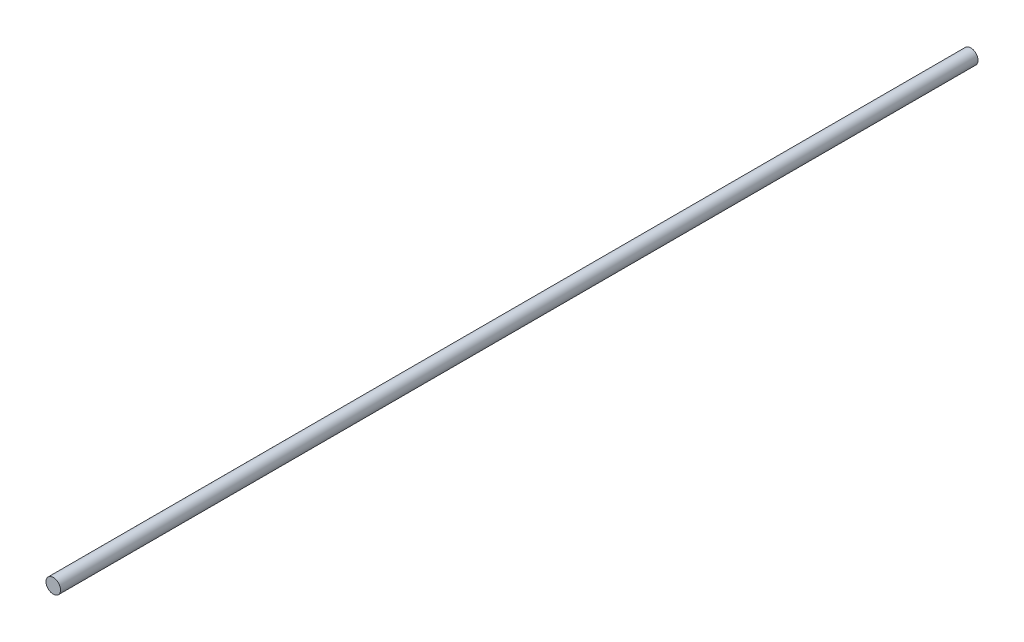
ISO-10303-21;
HEADER;
FILE_DESCRIPTION(('STEP AP214'),'2;1');
FILE_NAME('part.step','',(''),(''),'','','');
FILE_SCHEMA(('AUTOMOTIVE_DESIGN { 1 0 10303 214 1 1 1 1 }'));
ENDSEC;
DATA;
#1=APPLICATION_CONTEXT('core data for automotive mechanical design processes');
#2=APPLICATION_PROTOCOL_DEFINITION('international standard','automotive_design',2000,#1);
#3=PRODUCT_CONTEXT('',#1,'mechanical');
#4=PRODUCT('Part','Part','',(#3));
#5=PRODUCT_RELATED_PRODUCT_CATEGORY('part','',(#4));
#6=PRODUCT_DEFINITION_FORMATION('','',#4);
#7=PRODUCT_DEFINITION_CONTEXT('part definition',#1,'design');
#8=PRODUCT_DEFINITION('design','',#6,#7);
#9=PRODUCT_DEFINITION_SHAPE('','',#8);
#10=(LENGTH_UNIT() NAMED_UNIT(*) SI_UNIT(.MILLI.,.METRE.));
#11=(NAMED_UNIT(*) PLANE_ANGLE_UNIT() SI_UNIT($,.RADIAN.));
#12=(NAMED_UNIT(*) SI_UNIT($,.STERADIAN.) SOLID_ANGLE_UNIT());
#13=UNCERTAINTY_MEASURE_WITH_UNIT(LENGTH_MEASURE(1.E-05),#10,'distance_accuracy_value','');
#14=(GEOMETRIC_REPRESENTATION_CONTEXT(3) GLOBAL_UNCERTAINTY_ASSIGNED_CONTEXT((#13)) GLOBAL_UNIT_ASSIGNED_CONTEXT((#10,
#11,#12)) REPRESENTATION_CONTEXT('',''));
#15=CARTESIAN_POINT('',(0.,0.,0.));
#16=DIRECTION('',(0.,0.,1.));
#17=DIRECTION('',(1.,0.,0.));
#18=AXIS2_PLACEMENT_3D('',#15,#16,#17);
#19=CARTESIAN_POINT('',(0.,0.,0.));
#20=DIRECTION('',(0.,0.,1.));
#21=DIRECTION('',(1.,0.,0.));
#22=AXIS2_PLACEMENT_3D('',#19,#20,#21);
#23=PLANE('',#22);
#24=CARTESIAN_POINT('',(0.,0.,0.));
#25=DIRECTION('',(0.,0.,1.));
#26=DIRECTION('',(1.,0.,0.));
#27=AXIS2_PLACEMENT_3D('',#24,#25,#26);
#28=CIRCLE('',#27,2.38125);
#29=CARTESIAN_POINT('',(2.38125,0.,0.));
#30=VERTEX_POINT('',#29);
#31=EDGE_CURVE('E53',#30,#30,#28,.T.);
#32=ORIENTED_EDGE('',*,*,#31,.F.);
#33=EDGE_LOOP('',(#32));
#34=FACE_BOUND('',#33,.T.);
#35=ADVANCED_FACE('F46',(#34),#23,.F.);
#36=CARTESIAN_POINT('',(0.,0.,300.));
#37=DIRECTION('',(0.,0.,1.));
#38=DIRECTION('',(1.,0.,0.));
#39=AXIS2_PLACEMENT_3D('',#36,#37,#38);
#40=PLANE('',#39);
#41=CARTESIAN_POINT('',(0.,0.,300.));
#42=DIRECTION('',(0.,0.,1.));
#43=DIRECTION('',(1.,0.,0.));
#44=AXIS2_PLACEMENT_3D('',#41,#42,#43);
#45=CIRCLE('',#44,2.38125);
#46=CARTESIAN_POINT('',(2.38125,0.,300.));
#47=VERTEX_POINT('',#46);
#48=EDGE_CURVE('E11',#47,#47,#45,.T.);
#49=ORIENTED_EDGE('',*,*,#48,.T.);
#50=EDGE_LOOP('',(#49));
#51=FACE_BOUND('',#50,.T.);
#52=ADVANCED_FACE('F64',(#51),#40,.T.);
#53=CARTESIAN_POINT('',(0.,0.,0.));
#54=DIRECTION('',(0.,0.,1.));
#55=DIRECTION('',(1.,0.,0.));
#56=AXIS2_PLACEMENT_3D('',#53,#54,#55);
#57=CYLINDRICAL_SURFACE('',#56,2.38125);
#58=CARTESIAN_POINT('',(2.38125,0.,0.));
#59=CARTESIAN_POINT('',(2.38125,0.,3.125));
#60=CARTESIAN_POINT('',(2.38125,0.,6.25));
#61=CARTESIAN_POINT('',(2.38125,0.,12.5));
#62=CARTESIAN_POINT('',(2.38125,0.,15.625));
#63=CARTESIAN_POINT('',(2.38125,0.,21.875));
#64=CARTESIAN_POINT('',(2.38125,0.,25.));
#65=CARTESIAN_POINT('',(2.38125,0.,31.25));
#66=CARTESIAN_POINT('',(2.38125,0.,34.375));
#67=CARTESIAN_POINT('',(2.38125,0.,40.625));
#68=CARTESIAN_POINT('',(2.38125,0.,43.75));
#69=CARTESIAN_POINT('',(2.38125,0.,50.));
#70=CARTESIAN_POINT('',(2.38125,0.,53.125));
#71=CARTESIAN_POINT('',(2.38125,0.,59.375));
#72=CARTESIAN_POINT('',(2.38125,0.,62.5));
#73=CARTESIAN_POINT('',(2.38125,0.,68.75));
#74=CARTESIAN_POINT('',(2.38125,0.,71.875));
#75=CARTESIAN_POINT('',(2.38125,0.,78.125));
#76=CARTESIAN_POINT('',(2.38125,0.,81.25));
#77=CARTESIAN_POINT('',(2.38125,0.,87.5));
#78=CARTESIAN_POINT('',(2.38125,0.,90.625));
#79=CARTESIAN_POINT('',(2.38125,0.,96.875));
#80=CARTESIAN_POINT('',(2.38125,0.,100.));
#81=CARTESIAN_POINT('',(2.38125,0.,106.25));
#82=CARTESIAN_POINT('',(2.38125,0.,109.375));
#83=CARTESIAN_POINT('',(2.38125,0.,115.625));
#84=CARTESIAN_POINT('',(2.38125,0.,118.75));
#85=CARTESIAN_POINT('',(2.38125,0.,125.));
#86=CARTESIAN_POINT('',(2.38125,0.,128.125));
#87=CARTESIAN_POINT('',(2.38125,0.,134.375));
#88=CARTESIAN_POINT('',(2.38125,0.,137.5));
#89=CARTESIAN_POINT('',(2.38125,0.,143.75));
#90=CARTESIAN_POINT('',(2.38125,0.,146.875));
#91=CARTESIAN_POINT('',(2.38125,0.,153.125));
#92=CARTESIAN_POINT('',(2.38125,0.,156.25));
#93=CARTESIAN_POINT('',(2.38125,0.,162.5));
#94=CARTESIAN_POINT('',(2.38125,0.,165.625));
#95=CARTESIAN_POINT('',(2.38125,0.,171.875));
#96=CARTESIAN_POINT('',(2.38125,0.,175.));
#97=CARTESIAN_POINT('',(2.38125,0.,181.25));
#98=CARTESIAN_POINT('',(2.38125,0.,184.375));
#99=CARTESIAN_POINT('',(2.38125,0.,190.625));
#100=CARTESIAN_POINT('',(2.38125,0.,193.75));
#101=CARTESIAN_POINT('',(2.38125,0.,200.));
#102=CARTESIAN_POINT('',(2.38125,0.,203.125));
#103=CARTESIAN_POINT('',(2.38125,0.,209.375));
#104=CARTESIAN_POINT('',(2.38125,0.,212.5));
#105=CARTESIAN_POINT('',(2.38125,0.,218.75));
#106=CARTESIAN_POINT('',(2.38125,0.,221.875));
#107=CARTESIAN_POINT('',(2.38125,0.,228.125));
#108=CARTESIAN_POINT('',(2.38125,0.,231.25));
#109=CARTESIAN_POINT('',(2.38125,0.,237.5));
#110=CARTESIAN_POINT('',(2.38125,0.,240.625));
#111=CARTESIAN_POINT('',(2.38125,0.,246.875));
#112=CARTESIAN_POINT('',(2.38125,0.,250.));
#113=CARTESIAN_POINT('',(2.38125,0.,256.25));
#114=CARTESIAN_POINT('',(2.38125,0.,259.375));
#115=CARTESIAN_POINT('',(2.38125,0.,265.625));
#116=CARTESIAN_POINT('',(2.38125,0.,268.75));
#117=CARTESIAN_POINT('',(2.38125,0.,275.));
#118=CARTESIAN_POINT('',(2.38125,0.,278.125));
#119=CARTESIAN_POINT('',(2.38125,0.,284.375));
#120=CARTESIAN_POINT('',(2.38125,0.,287.5));
#121=CARTESIAN_POINT('',(2.38125,0.,293.75));
#122=CARTESIAN_POINT('',(2.38125,0.,296.875));
#123=CARTESIAN_POINT('',(2.38125,0.,300.));
#124=B_SPLINE_CURVE_WITH_KNOTS('',3,(#58,#59,#60,#61,#62,#63,#64,#65,#66,#67,#68,#69,#70,#71,
#72,#73,#74,#75,#76,#77,#78,#79,#80,#81,#82,#83,#84,#85,#86,#87,#88,#89,#90,#91,#92,#93,#94,#95,
#96,#97,#98,#99,#100,#101,#102,#103,#104,#105,#106,#107,#108,#109,#110,#111,#112,#113,#114,#115,
#116,#117,#118,#119,#120,#121,#122,#123),.UNSPECIFIED.,.F.,.F.,(4,2,2,2,2,2,2,2,2,2,2,2,2,2,2,2,
2,2,2,2,2,2,2,2,2,2,2,2,2,2,2,2,4),(0.,9.375,18.75,28.125,37.5,46.875,56.25,65.625,75.,84.375,
93.75,103.125,112.5,121.875,131.25,140.625,150.,159.375,168.75,178.125,187.5,196.875,206.25,
215.625,225.,234.375,243.75,253.125,262.5,271.875,281.25,290.625,300.),.UNSPECIFIED.);
#125=EDGE_CURVE('BSEAM60',#30,#47,#124,.T.);
#126=ORIENTED_EDGE('',*,*,#31,.T.);
#127=ORIENTED_EDGE('',*,*,#48,.F.);
#128=ORIENTED_EDGE('',*,*,#125,.T.);
#129=ORIENTED_EDGE('',*,*,#125,.F.);
#130=EDGE_LOOP('',(#126,#128,#127,#129));
#131=FACE_BOUND('',#130,.T.);
#132=ADVANCED_FACE('F60',(#131),#57,.T.);
#133=CLOSED_SHELL('',(#35,#52,#132));
#134=MANIFOLD_SOLID_BREP('B2',#133);
#135=ADVANCED_BREP_SHAPE_REPRESENTATION('',(#18,#134),#14);
#136=SHAPE_DEFINITION_REPRESENTATION(#9,#135);
ENDSEC;
END-ISO-10303-21;
